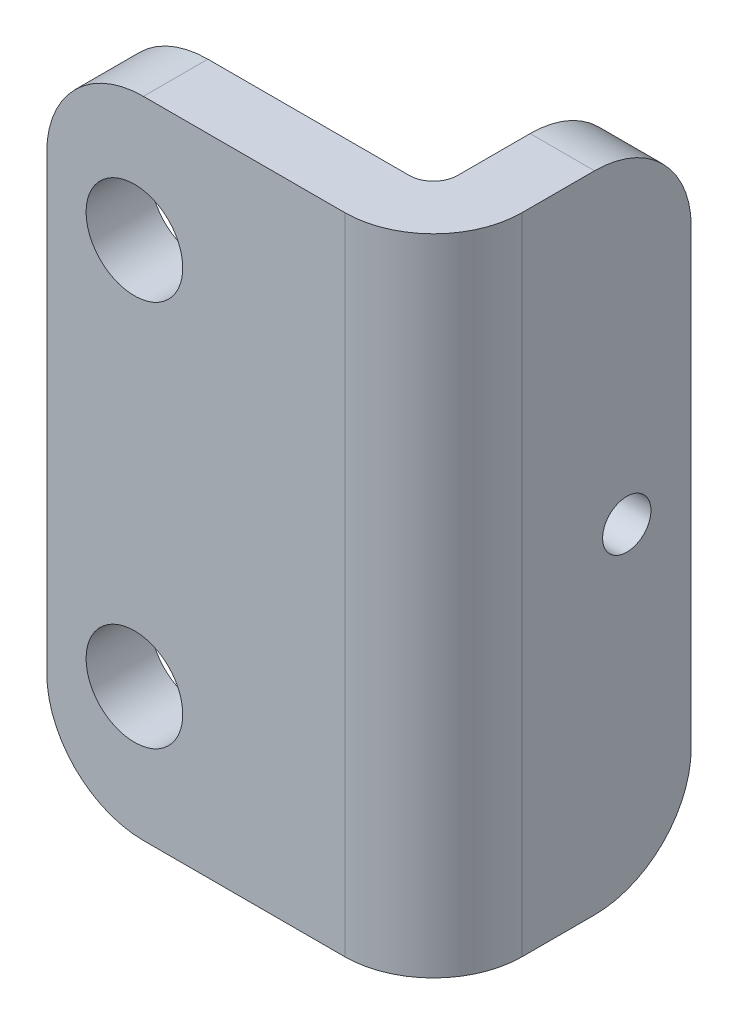
ISO-10303-21;
HEADER;
FILE_DESCRIPTION(('STEP AP214'),'2;1');
FILE_NAME('part.step','',(''),(''),'','','');
FILE_SCHEMA(('AUTOMOTIVE_DESIGN { 1 0 10303 214 1 1 1 1 }'));
ENDSEC;
DATA;
#1=APPLICATION_CONTEXT('core data for automotive mechanical design processes');
#2=APPLICATION_PROTOCOL_DEFINITION('international standard','automotive_design',2000,#1);
#3=PRODUCT_CONTEXT('',#1,'mechanical');
#4=PRODUCT('Part','Part','',(#3));
#5=PRODUCT_RELATED_PRODUCT_CATEGORY('part','',(#4));
#6=PRODUCT_DEFINITION_FORMATION('','',#4);
#7=PRODUCT_DEFINITION_CONTEXT('part definition',#1,'design');
#8=PRODUCT_DEFINITION('design','',#6,#7);
#9=PRODUCT_DEFINITION_SHAPE('','',#8);
#10=(LENGTH_UNIT() NAMED_UNIT(*) SI_UNIT(.MILLI.,.METRE.));
#11=(NAMED_UNIT(*) PLANE_ANGLE_UNIT() SI_UNIT($,.RADIAN.));
#12=(NAMED_UNIT(*) SI_UNIT($,.STERADIAN.) SOLID_ANGLE_UNIT());
#13=UNCERTAINTY_MEASURE_WITH_UNIT(LENGTH_MEASURE(1.E-05),#10,'distance_accuracy_value','');
#14=(GEOMETRIC_REPRESENTATION_CONTEXT(3) GLOBAL_UNCERTAINTY_ASSIGNED_CONTEXT((#13)) GLOBAL_UNIT_ASSIGNED_CONTEXT((#10,
#11,#12)) REPRESENTATION_CONTEXT('',''));
#15=CARTESIAN_POINT('',(0.,0.,0.));
#16=DIRECTION('',(0.,0.,1.));
#17=DIRECTION('',(1.,0.,0.));
#18=AXIS2_PLACEMENT_3D('',#15,#16,#17);
#19=CARTESIAN_POINT('',(1.04272999289097,29.,-2.05240944742962));
#20=DIRECTION('',(1.,0.,0.));
#21=DIRECTION('',(0.,0.,-1.));
#22=AXIS2_PLACEMENT_3D('',#19,#20,#21);
#23=PLANE('',#22);
#24=CARTESIAN_POINT('',(1.04272999289097,10.,-8.22740944742961));
#25=DIRECTION('',(-1.,0.,0.));
#26=DIRECTION('',(0.,0.,1.));
#27=AXIS2_PLACEMENT_3D('',#24,#25,#26);
#28=CIRCLE('',#27,1.425);
#29=CARTESIAN_POINT('',(1.04272999289097,10.,-6.80240944742961));
#30=VERTEX_POINT('',#29);
#31=EDGE_CURVE('E235',#30,#30,#28,.T.);
#32=ORIENTED_EDGE('',*,*,#31,.F.);
#33=EDGE_LOOP('',(#32));
#34=FACE_BOUND('',#33,.T.);
#35=DIRECTION('',(0.,-1.,0.));
#36=VECTOR('',#35,1.);
#37=CARTESIAN_POINT('',(1.04272999289097,29.,-12.0274094474296));
#38=LINE('',#37,#36);
#39=CARTESIAN_POINT('',(1.04272999289097,23.3,-12.0274094474296));
#40=VERTEX_POINT('',#39);
#41=CARTESIAN_POINT('',(1.04272999289097,-3.3,-12.0274094474296));
#42=VERTEX_POINT('',#41);
#43=EDGE_CURVE('E202',#40,#42,#38,.T.);
#44=ORIENTED_EDGE('',*,*,#43,.T.);
#45=CARTESIAN_POINT('',(1.04272999289097,-3.3,-6.32740944742962));
#46=DIRECTION('',(1.,0.,0.));
#47=DIRECTION('',(0.,0.,-1.));
#48=AXIS2_PLACEMENT_3D('',#45,#46,#47);
#49=CIRCLE('',#48,5.7);
#50=CARTESIAN_POINT('',(1.04272999289097,-9.,-6.32740944742962));
#51=VERTEX_POINT('',#50);
#52=EDGE_CURVE('E161',#42,#51,#49,.F.);
#53=ORIENTED_EDGE('',*,*,#52,.T.);
#54=DIRECTION('',(0.,0.,1.));
#55=VECTOR('',#54,1.);
#56=CARTESIAN_POINT('',(1.04272999289097,-9.,-2.05240944742962));
#57=LINE('',#56,#55);
#58=CARTESIAN_POINT('',(1.04272999289097,-9.,-2.05240944742962));
#59=VERTEX_POINT('',#58);
#60=EDGE_CURVE('E147',#51,#59,#57,.T.);
#61=ORIENTED_EDGE('',*,*,#60,.T.);
#62=DIRECTION('',(0.,-1.,0.));
#63=VECTOR('',#62,1.);
#64=CARTESIAN_POINT('',(1.04272999289097,29.,-2.05240944742962));
#65=LINE('',#64,#63);
#66=CARTESIAN_POINT('',(1.04272999289097,29.,-2.05240944742962));
#67=VERTEX_POINT('',#66);
#68=EDGE_CURVE('E139',#67,#59,#65,.T.);
#69=ORIENTED_EDGE('',*,*,#68,.F.);
#70=DIRECTION('',(0.,0.,1.));
#71=VECTOR('',#70,1.);
#72=CARTESIAN_POINT('',(1.04272999289097,29.,-2.05240944742962));
#73=LINE('',#72,#71);
#74=CARTESIAN_POINT('',(1.04272999289097,29.,-6.32740944742962));
#75=VERTEX_POINT('',#74);
#76=EDGE_CURVE('E123',#75,#67,#73,.T.);
#77=ORIENTED_EDGE('',*,*,#76,.F.);
#78=CARTESIAN_POINT('',(1.04272999289097,23.3,-6.32740944742962));
#79=DIRECTION('',(1.,0.,0.));
#80=DIRECTION('',(0.,0.,-1.));
#81=AXIS2_PLACEMENT_3D('',#78,#79,#80);
#82=CIRCLE('',#81,5.7);
#83=EDGE_CURVE('E159',#75,#40,#82,.F.);
#84=ORIENTED_EDGE('',*,*,#83,.T.);
#85=EDGE_LOOP('',(#44,#53,#61,#69,#77,#84));
#86=FACE_BOUND('',#85,.T.);
#87=ADVANCED_FACE('F34',(#34,#86),#23,.F.);
#88=CARTESIAN_POINT('',(-0.382270007109031,29.,-2.05240944742961));
#89=DIRECTION('',(0.,-1.,0.));
#90=DIRECTION('',(0.,0.,-1.));
#91=AXIS2_PLACEMENT_3D('',#88,#89,#90);
#92=CYLINDRICAL_SURFACE('',#91,1.425);
#93=CARTESIAN_POINT('',(-0.382270007109031,-9.,-2.05240944742961));
#94=DIRECTION('',(0.,-1.,0.));
#95=DIRECTION('',(0.,0.,1.));
#96=AXIS2_PLACEMENT_3D('',#93,#94,#95);
#97=CIRCLE('',#96,1.425);
#98=CARTESIAN_POINT('',(-0.38227000710904,-9.,-0.627409447429613));
#99=VERTEX_POINT('',#98);
#100=EDGE_CURVE('E213',#59,#99,#97,.T.);
#101=ORIENTED_EDGE('',*,*,#100,.T.);
#102=DIRECTION('',(0.,-1.,0.));
#103=VECTOR('',#102,1.);
#104=CARTESIAN_POINT('',(-0.38227000710904,29.,-0.627409447429613));
#105=LINE('',#104,#103);
#106=CARTESIAN_POINT('',(-0.38227000710904,29.,-0.627409447429613));
#107=VERTEX_POINT('',#106);
#108=EDGE_CURVE('E141',#107,#99,#105,.T.);
#109=ORIENTED_EDGE('',*,*,#108,.F.);
#110=CARTESIAN_POINT('',(-0.382270007109031,29.,-2.05240944742961));
#111=DIRECTION('',(0.,-1.,0.));
#112=DIRECTION('',(0.,0.,1.));
#113=AXIS2_PLACEMENT_3D('',#110,#111,#112);
#114=CIRCLE('',#113,1.425);
#115=EDGE_CURVE('E128',#67,#107,#114,.T.);
#116=ORIENTED_EDGE('',*,*,#115,.F.);
#117=ORIENTED_EDGE('',*,*,#68,.T.);
#118=EDGE_LOOP('',(#101,#109,#116,#117));
#119=FACE_BOUND('',#118,.T.);
#120=ADVANCED_FACE('F138',(#119),#92,.F.);
#121=CARTESIAN_POINT('',(-17.957270007109,29.,-0.627409447429613));
#122=DIRECTION('',(0.,0.,1.));
#123=DIRECTION('',(1.,0.,0.));
#124=AXIS2_PLACEMENT_3D('',#121,#122,#123);
#125=PLANE('',#124);
#126=CARTESIAN_POINT('',(-12.789270007109,21.4,-0.627409447429613));
#127=DIRECTION('',(0.,0.,-1.));
#128=DIRECTION('',(-1.,0.,0.));
#129=AXIS2_PLACEMENT_3D('',#126,#127,#128);
#130=CIRCLE('',#129,2.85);
#131=CARTESIAN_POINT('',(-15.639270007109,21.4,-0.627409447429613));
#132=VERTEX_POINT('',#131);
#133=EDGE_CURVE('E230',#132,#132,#130,.T.);
#134=ORIENTED_EDGE('',*,*,#133,.F.);
#135=EDGE_LOOP('',(#134));
#136=FACE_BOUND('',#135,.T.);
#137=CARTESIAN_POINT('',(-12.789270007109,-1.4,-0.627409447429613));
#138=DIRECTION('',(0.,0.,-1.));
#139=DIRECTION('',(-1.,0.,0.));
#140=AXIS2_PLACEMENT_3D('',#137,#138,#139);
#141=CIRCLE('',#140,2.85);
#142=CARTESIAN_POINT('',(-15.639270007109,-1.4,-0.627409447429613));
#143=VERTEX_POINT('',#142);
#144=EDGE_CURVE('E223',#143,#143,#141,.T.);
#145=ORIENTED_EDGE('',*,*,#144,.F.);
#146=EDGE_LOOP('',(#145));
#147=FACE_BOUND('',#146,.T.);
#148=DIRECTION('',(0.,-1.,0.));
#149=VECTOR('',#148,1.);
#150=CARTESIAN_POINT('',(-17.957270007109,29.,-0.627409447429613));
#151=LINE('',#150,#149);
#152=CARTESIAN_POINT('',(-17.957270007109,23.3,-0.627409447429613));
#153=VERTEX_POINT('',#152);
#154=CARTESIAN_POINT('',(-17.957270007109,-3.3,-0.627409447429613));
#155=VERTEX_POINT('',#154);
#156=EDGE_CURVE('E153',#153,#155,#151,.T.);
#157=ORIENTED_EDGE('',*,*,#156,.F.);
#158=CARTESIAN_POINT('',(-12.257270007109,23.3,-0.627409447429613));
#159=DIRECTION('',(0.,0.,1.));
#160=DIRECTION('',(1.,0.,0.));
#161=AXIS2_PLACEMENT_3D('',#158,#159,#160);
#162=CIRCLE('',#161,5.7);
#163=CARTESIAN_POINT('',(-12.257270007109,29.,-0.627409447429613));
#164=VERTEX_POINT('',#163);
#165=EDGE_CURVE('E11',#153,#164,#162,.F.);
#166=ORIENTED_EDGE('',*,*,#165,.T.);
#167=DIRECTION('',(-1.,0.,0.));
#168=VECTOR('',#167,1.);
#169=CARTESIAN_POINT('',(-17.957270007109,29.,-0.627409447429613));
#170=LINE('',#169,#168);
#171=EDGE_CURVE('E143',#107,#164,#170,.T.);
#172=ORIENTED_EDGE('',*,*,#171,.F.);
#173=ORIENTED_EDGE('',*,*,#108,.T.);
#174=DIRECTION('',(-1.,0.,0.));
#175=VECTOR('',#174,1.);
#176=CARTESIAN_POINT('',(-17.957270007109,-9.,-0.627409447429613));
#177=LINE('',#176,#175);
#178=CARTESIAN_POINT('',(-12.257270007109,-9.,-0.627409447429613));
#179=VERTEX_POINT('',#178);
#180=EDGE_CURVE('E211',#99,#179,#177,.T.);
#181=ORIENTED_EDGE('',*,*,#180,.T.);
#182=CARTESIAN_POINT('',(-12.257270007109,-3.3,-0.627409447429613));
#183=DIRECTION('',(0.,0.,1.));
#184=DIRECTION('',(1.,0.,0.));
#185=AXIS2_PLACEMENT_3D('',#182,#183,#184);
#186=CIRCLE('',#185,5.7);
#187=EDGE_CURVE('E42',#179,#155,#186,.F.);
#188=ORIENTED_EDGE('',*,*,#187,.T.);
#189=EDGE_LOOP('',(#157,#166,#172,#173,#181,#188));
#190=FACE_BOUND('',#189,.T.);
#191=ADVANCED_FACE('F256',(#136,#147,#190),#125,.F.);
#192=CARTESIAN_POINT('',(-17.957270007109,29.,3.17259055257039));
#193=DIRECTION('',(1.,0.,0.));
#194=DIRECTION('',(0.,0.,-1.));
#195=AXIS2_PLACEMENT_3D('',#192,#193,#194);
#196=PLANE('',#195);
#197=DIRECTION('',(0.,-1.,0.));
#198=VECTOR('',#197,1.);
#199=CARTESIAN_POINT('',(-17.957270007109,29.,3.17259055257039));
#200=LINE('',#199,#198);
#201=CARTESIAN_POINT('',(-17.957270007109,23.3,3.17259055257039));
#202=VERTEX_POINT('',#201);
#203=CARTESIAN_POINT('',(-17.957270007109,-3.3,3.17259055257039));
#204=VERTEX_POINT('',#203);
#205=EDGE_CURVE('E185',#202,#204,#200,.T.);
#206=ORIENTED_EDGE('',*,*,#205,.F.);
#207=DIRECTION('',(0.,0.,1.));
#208=VECTOR('',#207,1.);
#209=CARTESIAN_POINT('',(-17.957270007109,23.3,3.17259055257039));
#210=LINE('',#209,#208);
#211=EDGE_CURVE('E55',#202,#153,#210,.F.);
#212=ORIENTED_EDGE('',*,*,#211,.T.);
#213=ORIENTED_EDGE('',*,*,#156,.T.);
#214=DIRECTION('',(0.,0.,1.));
#215=VECTOR('',#214,1.);
#216=CARTESIAN_POINT('',(-17.957270007109,-3.3,3.17259055257039));
#217=LINE('',#216,#215);
#218=EDGE_CURVE('E179',#155,#204,#217,.T.);
#219=ORIENTED_EDGE('',*,*,#218,.T.);
#220=EDGE_LOOP('',(#206,#212,#213,#219));
#221=FACE_BOUND('',#220,.T.);
#222=ADVANCED_FACE('F184',(#221),#196,.F.);
#223=CARTESIAN_POINT('',(-0.382270007109065,29.,3.17259055257039));
#224=DIRECTION('',(0.,0.,-1.));
#225=DIRECTION('',(-1.,0.,0.));
#226=AXIS2_PLACEMENT_3D('',#223,#224,#225);
#227=PLANE('',#226);
#228=CARTESIAN_POINT('',(-12.789270007109,21.4,3.17259055257039));
#229=DIRECTION('',(0.,0.,-1.));
#230=DIRECTION('',(-1.,0.,0.));
#231=AXIS2_PLACEMENT_3D('',#228,#229,#230);
#232=CIRCLE('',#231,2.85);
#233=CARTESIAN_POINT('',(-15.639270007109,21.4,3.17259055257039));
#234=VERTEX_POINT('',#233);
#235=EDGE_CURVE('E216',#234,#234,#232,.T.);
#236=ORIENTED_EDGE('',*,*,#235,.T.);
#237=EDGE_LOOP('',(#236));
#238=FACE_BOUND('',#237,.T.);
#239=CARTESIAN_POINT('',(-12.789270007109,-1.4,3.17259055257039));
#240=DIRECTION('',(0.,0.,-1.));
#241=DIRECTION('',(-1.,0.,0.));
#242=AXIS2_PLACEMENT_3D('',#239,#240,#241);
#243=CIRCLE('',#242,2.85);
#244=CARTESIAN_POINT('',(-15.639270007109,-1.4,3.17259055257039));
#245=VERTEX_POINT('',#244);
#246=EDGE_CURVE('E226',#245,#245,#243,.T.);
#247=ORIENTED_EDGE('',*,*,#246,.T.);
#248=EDGE_LOOP('',(#247));
#249=FACE_BOUND('',#248,.T.);
#250=DIRECTION('',(1.,0.,0.));
#251=VECTOR('',#250,1.);
#252=CARTESIAN_POINT('',(-0.382270007109065,29.,3.17259055257039));
#253=LINE('',#252,#251);
#254=CARTESIAN_POINT('',(-12.257270007109,29.,3.17259055257039));
#255=VERTEX_POINT('',#254);
#256=CARTESIAN_POINT('',(-0.382270007109065,29.,3.17259055257039));
#257=VERTEX_POINT('',#256);
#258=EDGE_CURVE('E220',#255,#257,#253,.T.);
#259=ORIENTED_EDGE('',*,*,#258,.F.);
#260=CARTESIAN_POINT('',(-12.257270007109,23.3,3.17259055257039));
#261=DIRECTION('',(0.,0.,-1.));
#262=DIRECTION('',(-1.,0.,0.));
#263=AXIS2_PLACEMENT_3D('',#260,#261,#262);
#264=CIRCLE('',#263,5.7);
#265=EDGE_CURVE('E177',#255,#202,#264,.F.);
#266=ORIENTED_EDGE('',*,*,#265,.T.);
#267=ORIENTED_EDGE('',*,*,#205,.T.);
#268=CARTESIAN_POINT('',(-12.257270007109,-3.3,3.17259055257039));
#269=DIRECTION('',(0.,0.,-1.));
#270=DIRECTION('',(-1.,0.,0.));
#271=AXIS2_PLACEMENT_3D('',#268,#269,#270);
#272=CIRCLE('',#271,5.7);
#273=CARTESIAN_POINT('',(-12.257270007109,-9.,3.17259055257039));
#274=VERTEX_POINT('',#273);
#275=EDGE_CURVE('E175',#204,#274,#272,.F.);
#276=ORIENTED_EDGE('',*,*,#275,.T.);
#277=DIRECTION('',(1.,0.,0.));
#278=VECTOR('',#277,1.);
#279=CARTESIAN_POINT('',(-0.382270007109065,-9.,3.17259055257039));
#280=LINE('',#279,#278);
#281=CARTESIAN_POINT('',(-0.382270007109065,-9.,3.17259055257039));
#282=VERTEX_POINT('',#281);
#283=EDGE_CURVE('E209',#274,#282,#280,.T.);
#284=ORIENTED_EDGE('',*,*,#283,.T.);
#285=DIRECTION('',(0.,-1.,0.));
#286=VECTOR('',#285,1.);
#287=CARTESIAN_POINT('',(-0.382270007109065,29.,3.17259055257039));
#288=LINE('',#287,#286);
#289=EDGE_CURVE('E191',#257,#282,#288,.T.);
#290=ORIENTED_EDGE('',*,*,#289,.F.);
#291=EDGE_LOOP('',(#259,#266,#267,#276,#284,#290));
#292=FACE_BOUND('',#291,.T.);
#293=ADVANCED_FACE('F189',(#238,#249,#292),#227,.F.);
#294=CARTESIAN_POINT('',(-0.382270007109028,29.,-2.05240944742961));
#295=DIRECTION('',(0.,-1.,0.));
#296=DIRECTION('',(0.,0.,-1.));
#297=AXIS2_PLACEMENT_3D('',#294,#295,#296);
#298=CYLINDRICAL_SURFACE('',#297,5.225);
#299=CARTESIAN_POINT('',(-0.382270007109028,-9.,-2.05240944742961));
#300=DIRECTION('',(0.,1.,0.));
#301=DIRECTION('',(0.,0.,-1.));
#302=AXIS2_PLACEMENT_3D('',#299,#300,#301);
#303=CIRCLE('',#302,5.225);
#304=CARTESIAN_POINT('',(4.84272999289097,-9.,-2.05240944742965));
#305=VERTEX_POINT('',#304);
#306=EDGE_CURVE('E207',#282,#305,#303,.T.);
#307=ORIENTED_EDGE('',*,*,#306,.T.);
#308=DIRECTION('',(0.,-1.,0.));
#309=VECTOR('',#308,1.);
#310=CARTESIAN_POINT('',(4.84272999289097,29.,-2.05240944742965));
#311=LINE('',#310,#309);
#312=CARTESIAN_POINT('',(4.84272999289097,29.,-2.05240944742965));
#313=VERTEX_POINT('',#312);
#314=EDGE_CURVE('E194',#313,#305,#311,.T.);
#315=ORIENTED_EDGE('',*,*,#314,.F.);
#316=CARTESIAN_POINT('',(-0.382270007109028,29.,-2.05240944742961));
#317=DIRECTION('',(0.,1.,0.));
#318=DIRECTION('',(0.,0.,-1.));
#319=AXIS2_PLACEMENT_3D('',#316,#317,#318);
#320=CIRCLE('',#319,5.225);
#321=EDGE_CURVE('E218',#257,#313,#320,.T.);
#322=ORIENTED_EDGE('',*,*,#321,.F.);
#323=ORIENTED_EDGE('',*,*,#289,.T.);
#324=EDGE_LOOP('',(#307,#315,#322,#323));
#325=FACE_BOUND('',#324,.T.);
#326=ADVANCED_FACE('F282',(#325),#298,.T.);
#327=CARTESIAN_POINT('',(4.84272999289097,29.,-12.0274094474296));
#328=DIRECTION('',(-1.,0.,0.));
#329=DIRECTION('',(0.,0.,1.));
#330=AXIS2_PLACEMENT_3D('',#327,#328,#329);
#331=PLANE('',#330);
#332=CARTESIAN_POINT('',(4.84272999289097,10.,-8.22740944742961));
#333=DIRECTION('',(-1.,0.,0.));
#334=DIRECTION('',(0.,0.,1.));
#335=AXIS2_PLACEMENT_3D('',#332,#333,#334);
#336=CIRCLE('',#335,1.425);
#337=CARTESIAN_POINT('',(4.84272999289097,10.,-6.80240944742961));
#338=VERTEX_POINT('',#337);
#339=EDGE_CURVE('E227',#338,#338,#336,.T.);
#340=ORIENTED_EDGE('',*,*,#339,.T.);
#341=EDGE_LOOP('',(#340));
#342=FACE_BOUND('',#341,.T.);
#343=DIRECTION('',(0.,0.,-1.));
#344=VECTOR('',#343,1.);
#345=CARTESIAN_POINT('',(4.84272999289097,-9.,-12.0274094474296));
#346=LINE('',#345,#344);
#347=CARTESIAN_POINT('',(4.84272999289097,-9.,-6.32740944742962));
#348=VERTEX_POINT('',#347);
#349=EDGE_CURVE('E134',#305,#348,#346,.T.);
#350=ORIENTED_EDGE('',*,*,#349,.T.);
#351=CARTESIAN_POINT('',(4.84272999289097,-3.3,-6.32740944742962));
#352=DIRECTION('',(-1.,0.,0.));
#353=DIRECTION('',(0.,0.,1.));
#354=AXIS2_PLACEMENT_3D('',#351,#352,#353);
#355=CIRCLE('',#354,5.7);
#356=CARTESIAN_POINT('',(4.84272999289097,-3.3,-12.0274094474296));
#357=VERTEX_POINT('',#356);
#358=EDGE_CURVE('E169',#348,#357,#355,.F.);
#359=ORIENTED_EDGE('',*,*,#358,.T.);
#360=DIRECTION('',(0.,-1.,0.));
#361=VECTOR('',#360,1.);
#362=CARTESIAN_POINT('',(4.84272999289097,29.,-12.0274094474296));
#363=LINE('',#362,#361);
#364=CARTESIAN_POINT('',(4.84272999289097,23.3,-12.0274094474296));
#365=VERTEX_POINT('',#364);
#366=EDGE_CURVE('E199',#365,#357,#363,.T.);
#367=ORIENTED_EDGE('',*,*,#366,.F.);
#368=CARTESIAN_POINT('',(4.84272999289097,23.3,-6.32740944742962));
#369=DIRECTION('',(-1.,0.,0.));
#370=DIRECTION('',(0.,0.,1.));
#371=AXIS2_PLACEMENT_3D('',#368,#369,#370);
#372=CIRCLE('',#371,5.7);
#373=CARTESIAN_POINT('',(4.84272999289097,29.,-6.32740944742962));
#374=VERTEX_POINT('',#373);
#375=EDGE_CURVE('E167',#365,#374,#372,.F.);
#376=ORIENTED_EDGE('',*,*,#375,.T.);
#377=DIRECTION('',(0.,0.,-1.));
#378=VECTOR('',#377,1.);
#379=CARTESIAN_POINT('',(4.84272999289097,29.,-12.0274094474296));
#380=LINE('',#379,#378);
#381=EDGE_CURVE('E204',#313,#374,#380,.T.);
#382=ORIENTED_EDGE('',*,*,#381,.F.);
#383=ORIENTED_EDGE('',*,*,#314,.T.);
#384=EDGE_LOOP('',(#350,#359,#367,#376,#382,#383));
#385=FACE_BOUND('',#384,.T.);
#386=ADVANCED_FACE('F241',(#342,#385),#331,.F.);
#387=CARTESIAN_POINT('',(1.04272999289097,29.,-12.0274094474296));
#388=DIRECTION('',(0.,0.,1.));
#389=DIRECTION('',(1.,0.,0.));
#390=AXIS2_PLACEMENT_3D('',#387,#388,#389);
#391=PLANE('',#390);
#392=ORIENTED_EDGE('',*,*,#366,.T.);
#393=DIRECTION('',(-1.,0.,0.));
#394=VECTOR('',#393,1.);
#395=CARTESIAN_POINT('',(1.04272999289097,-3.3,-12.0274094474296));
#396=LINE('',#395,#394);
#397=EDGE_CURVE('E151',#357,#42,#396,.T.);
#398=ORIENTED_EDGE('',*,*,#397,.T.);
#399=ORIENTED_EDGE('',*,*,#43,.F.);
#400=DIRECTION('',(-1.,0.,0.));
#401=VECTOR('',#400,1.);
#402=CARTESIAN_POINT('',(1.04272999289097,23.3,-12.0274094474296));
#403=LINE('',#402,#401);
#404=EDGE_CURVE('E149',#40,#365,#403,.F.);
#405=ORIENTED_EDGE('',*,*,#404,.T.);
#406=EDGE_LOOP('',(#392,#398,#399,#405));
#407=FACE_BOUND('',#406,.T.);
#408=ADVANCED_FACE('F288',(#407),#391,.F.);
#409=CARTESIAN_POINT('',(-0.382270007109028,29.,-2.05240944742961));
#410=DIRECTION('',(0.,-1.,0.));
#411=DIRECTION('',(0.,0.,-1.));
#412=AXIS2_PLACEMENT_3D('',#409,#410,#411);
#413=PLANE('',#412);
#414=ORIENTED_EDGE('',*,*,#381,.T.);
#415=DIRECTION('',(-1.,0.,0.));
#416=VECTOR('',#415,1.);
#417=CARTESIAN_POINT('',(-0.382270007109028,29.,-6.32740944742962));
#418=LINE('',#417,#416);
#419=EDGE_CURVE('E131',#374,#75,#418,.T.);
#420=ORIENTED_EDGE('',*,*,#419,.T.);
#421=ORIENTED_EDGE('',*,*,#76,.T.);
#422=ORIENTED_EDGE('',*,*,#115,.T.);
#423=ORIENTED_EDGE('',*,*,#171,.T.);
#424=DIRECTION('',(0.,0.,1.));
#425=VECTOR('',#424,1.);
#426=CARTESIAN_POINT('',(-12.257270007109,29.,-2.05240944742962));
#427=LINE('',#426,#425);
#428=EDGE_CURVE('E171',#164,#255,#427,.T.);
#429=ORIENTED_EDGE('',*,*,#428,.T.);
#430=ORIENTED_EDGE('',*,*,#258,.T.);
#431=ORIENTED_EDGE('',*,*,#321,.T.);
#432=EDGE_LOOP('',(#414,#420,#421,#422,#423,#429,#430,#431));
#433=FACE_BOUND('',#432,.T.);
#434=ADVANCED_FACE('F126',(#433),#413,.F.);
#435=CARTESIAN_POINT('',(-0.382270007109028,-9.,-2.05240944742961));
#436=DIRECTION('',(0.,-1.,0.));
#437=DIRECTION('',(0.,0.,-1.));
#438=AXIS2_PLACEMENT_3D('',#435,#436,#437);
#439=PLANE('',#438);
#440=ORIENTED_EDGE('',*,*,#60,.F.);
#441=DIRECTION('',(-1.,0.,0.));
#442=VECTOR('',#441,1.);
#443=CARTESIAN_POINT('',(4.84272999289097,-9.,-6.32740944742962));
#444=LINE('',#443,#442);
#445=EDGE_CURVE('E165',#51,#348,#444,.F.);
#446=ORIENTED_EDGE('',*,*,#445,.T.);
#447=ORIENTED_EDGE('',*,*,#349,.F.);
#448=ORIENTED_EDGE('',*,*,#306,.F.);
#449=ORIENTED_EDGE('',*,*,#283,.F.);
#450=DIRECTION('',(0.,0.,1.));
#451=VECTOR('',#450,1.);
#452=CARTESIAN_POINT('',(-12.257270007109,-9.,-0.627409447429608));
#453=LINE('',#452,#451);
#454=EDGE_CURVE('E163',#274,#179,#453,.F.);
#455=ORIENTED_EDGE('',*,*,#454,.T.);
#456=ORIENTED_EDGE('',*,*,#180,.F.);
#457=ORIENTED_EDGE('',*,*,#100,.F.);
#458=EDGE_LOOP('',(#440,#446,#447,#448,#449,#455,#456,#457));
#459=FACE_BOUND('',#458,.T.);
#460=ADVANCED_FACE('F264',(#459),#439,.T.);
#461=CARTESIAN_POINT('',(1.04272999289097,-3.3,-6.32740944742962));
#462=DIRECTION('',(1.,0.,0.));
#463=DIRECTION('',(0.,0.,-1.));
#464=AXIS2_PLACEMENT_3D('',#461,#462,#463);
#465=CYLINDRICAL_SURFACE('',#464,5.7);
#466=ORIENTED_EDGE('',*,*,#358,.F.);
#467=ORIENTED_EDGE('',*,*,#445,.F.);
#468=ORIENTED_EDGE('',*,*,#52,.F.);
#469=ORIENTED_EDGE('',*,*,#397,.F.);
#470=EDGE_LOOP('',(#466,#467,#468,#469));
#471=FACE_BOUND('',#470,.T.);
#472=ADVANCED_FACE('F260',(#471),#465,.T.);
#473=CARTESIAN_POINT('',(-0.382270007109028,23.3,-6.32740944742962));
#474=DIRECTION('',(-1.,0.,0.));
#475=DIRECTION('',(0.,0.,1.));
#476=AXIS2_PLACEMENT_3D('',#473,#474,#475);
#477=CYLINDRICAL_SURFACE('',#476,5.7);
#478=ORIENTED_EDGE('',*,*,#375,.F.);
#479=ORIENTED_EDGE('',*,*,#404,.F.);
#480=ORIENTED_EDGE('',*,*,#83,.F.);
#481=ORIENTED_EDGE('',*,*,#419,.F.);
#482=EDGE_LOOP('',(#478,#479,#480,#481));
#483=FACE_BOUND('',#482,.T.);
#484=ADVANCED_FACE('F263',(#483),#477,.T.);
#485=CARTESIAN_POINT('',(-12.257270007109,23.3,-2.05240944742962));
#486=DIRECTION('',(0.,0.,1.));
#487=DIRECTION('',(1.,0.,0.));
#488=AXIS2_PLACEMENT_3D('',#485,#486,#487);
#489=CYLINDRICAL_SURFACE('',#488,5.7);
#490=ORIENTED_EDGE('',*,*,#165,.F.);
#491=ORIENTED_EDGE('',*,*,#211,.F.);
#492=ORIENTED_EDGE('',*,*,#265,.F.);
#493=ORIENTED_EDGE('',*,*,#428,.F.);
#494=EDGE_LOOP('',(#490,#491,#492,#493));
#495=FACE_BOUND('',#494,.T.);
#496=ADVANCED_FACE('F267',(#495),#489,.T.);
#497=CARTESIAN_POINT('',(-12.257270007109,-3.3,3.17259055257039));
#498=DIRECTION('',(0.,0.,-1.));
#499=DIRECTION('',(-1.,0.,0.));
#500=AXIS2_PLACEMENT_3D('',#497,#498,#499);
#501=CYLINDRICAL_SURFACE('',#500,5.7);
#502=ORIENTED_EDGE('',*,*,#187,.F.);
#503=ORIENTED_EDGE('',*,*,#454,.F.);
#504=ORIENTED_EDGE('',*,*,#275,.F.);
#505=ORIENTED_EDGE('',*,*,#218,.F.);
#506=EDGE_LOOP('',(#502,#503,#504,#505));
#507=FACE_BOUND('',#506,.T.);
#508=ADVANCED_FACE('F36',(#507),#501,.T.);
#509=CARTESIAN_POINT('',(-12.789270007109,-1.4,3.17259055257039));
#510=DIRECTION('',(0.,0.,-1.));
#511=DIRECTION('',(-1.,0.,0.));
#512=AXIS2_PLACEMENT_3D('',#509,#510,#511);
#513=CYLINDRICAL_SURFACE('',#512,2.85);
#514=ORIENTED_EDGE('',*,*,#246,.F.);
#515=EDGE_LOOP('',(#514));
#516=FACE_BOUND('',#515,.T.);
#517=ORIENTED_EDGE('',*,*,#144,.T.);
#518=EDGE_LOOP('',(#517));
#519=FACE_BOUND('',#518,.T.);
#520=ADVANCED_FACE('F274',(#516,#519),#513,.F.);
#521=CARTESIAN_POINT('',(-12.789270007109,21.4,3.17259055257039));
#522=DIRECTION('',(0.,0.,-1.));
#523=DIRECTION('',(-1.,0.,0.));
#524=AXIS2_PLACEMENT_3D('',#521,#522,#523);
#525=CYLINDRICAL_SURFACE('',#524,2.85);
#526=ORIENTED_EDGE('',*,*,#235,.F.);
#527=EDGE_LOOP('',(#526));
#528=FACE_BOUND('',#527,.T.);
#529=ORIENTED_EDGE('',*,*,#133,.T.);
#530=EDGE_LOOP('',(#529));
#531=FACE_BOUND('',#530,.T.);
#532=ADVANCED_FACE('F247',(#528,#531),#525,.F.);
#533=CARTESIAN_POINT('',(4.84272999289097,10.,-8.22740944742961));
#534=DIRECTION('',(-1.,0.,0.));
#535=DIRECTION('',(0.,0.,1.));
#536=AXIS2_PLACEMENT_3D('',#533,#534,#535);
#537=CYLINDRICAL_SURFACE('',#536,1.425);
#538=ORIENTED_EDGE('',*,*,#339,.F.);
#539=EDGE_LOOP('',(#538));
#540=FACE_BOUND('',#539,.T.);
#541=ORIENTED_EDGE('',*,*,#31,.T.);
#542=EDGE_LOOP('',(#541));
#543=FACE_BOUND('',#542,.T.);
#544=ADVANCED_FACE('F244',(#540,#543),#537,.F.);
#545=CLOSED_SHELL('',(#87,#120,#191,#222,#293,#326,#386,#408,#434,#460,#472,#484,#496,#508,#520,
#532,#544));
#546=MANIFOLD_SOLID_BREP('B2',#545);
#547=ADVANCED_BREP_SHAPE_REPRESENTATION('',(#18,#546),#14);
#548=SHAPE_DEFINITION_REPRESENTATION(#9,#547);
ENDSEC;
END-ISO-10303-21;
